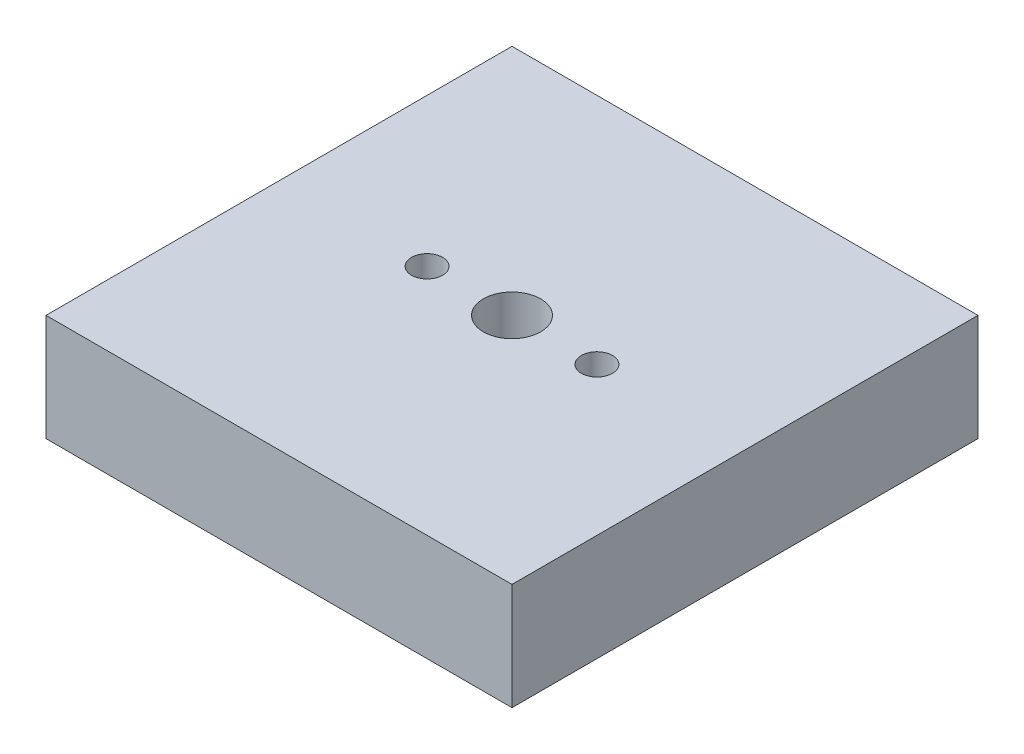
ISO-10303-21;
HEADER;
FILE_DESCRIPTION(('STEP AP214'),'2;1');
FILE_NAME('part.step','',(''),(''),'','','');
FILE_SCHEMA(('AUTOMOTIVE_DESIGN { 1 0 10303 214 1 1 1 1 }'));
ENDSEC;
DATA;
#1=APPLICATION_CONTEXT('core data for automotive mechanical design processes');
#2=APPLICATION_PROTOCOL_DEFINITION('international standard','automotive_design',2000,#1);
#3=PRODUCT_CONTEXT('',#1,'mechanical');
#4=PRODUCT('Part','Part','',(#3));
#5=PRODUCT_RELATED_PRODUCT_CATEGORY('part','',(#4));
#6=PRODUCT_DEFINITION_FORMATION('','',#4);
#7=PRODUCT_DEFINITION_CONTEXT('part definition',#1,'design');
#8=PRODUCT_DEFINITION('design','',#6,#7);
#9=PRODUCT_DEFINITION_SHAPE('','',#8);
#10=(LENGTH_UNIT() NAMED_UNIT(*) SI_UNIT(.MILLI.,.METRE.));
#11=(NAMED_UNIT(*) PLANE_ANGLE_UNIT() SI_UNIT($,.RADIAN.));
#12=(NAMED_UNIT(*) SI_UNIT($,.STERADIAN.) SOLID_ANGLE_UNIT());
#13=UNCERTAINTY_MEASURE_WITH_UNIT(LENGTH_MEASURE(1.E-05),#10,'distance_accuracy_value','');
#14=(GEOMETRIC_REPRESENTATION_CONTEXT(3) GLOBAL_UNCERTAINTY_ASSIGNED_CONTEXT((#13)) GLOBAL_UNIT_ASSIGNED_CONTEXT((#10,
#11,#12)) REPRESENTATION_CONTEXT('',''));
#15=CARTESIAN_POINT('',(0.,0.,0.));
#16=DIRECTION('',(0.,0.,1.));
#17=DIRECTION('',(1.,0.,0.));
#18=AXIS2_PLACEMENT_3D('',#15,#16,#17);
#19=CARTESIAN_POINT('',(0.,2.2,-9.6));
#20=DIRECTION('',(0.,-1.,0.));
#21=DIRECTION('',(0.,0.,-1.));
#22=AXIS2_PLACEMENT_3D('',#19,#20,#21);
#23=PLANE('',#22);
#24=CARTESIAN_POINT('',(3.05,2.2,-4.8));
#25=DIRECTION('',(0.,1.,0.));
#26=DIRECTION('',(0.,0.,1.));
#27=AXIS2_PLACEMENT_3D('',#24,#25,#26);
#28=CIRCLE('',#27,0.32);
#29=CARTESIAN_POINT('',(3.05,2.2,-4.48));
#30=VERTEX_POINT('',#29);
#31=EDGE_CURVE('E115',#30,#30,#28,.T.);
#32=ORIENTED_EDGE('',*,*,#31,.F.);
#33=EDGE_LOOP('',(#32));
#34=FACE_BOUND('',#33,.T.);
#35=DIRECTION('',(0.,0.,1.));
#36=VECTOR('',#35,1.);
#37=CARTESIAN_POINT('',(0.,2.2,0.));
#38=LINE('',#37,#36);
#39=CARTESIAN_POINT('',(0.,2.2,-9.6));
#40=VERTEX_POINT('',#39);
#41=CARTESIAN_POINT('',(0.,2.2,0.));
#42=VERTEX_POINT('',#41);
#43=EDGE_CURVE('E85',#40,#42,#38,.T.);
#44=ORIENTED_EDGE('',*,*,#43,.T.);
#45=DIRECTION('',(1.,0.,0.));
#46=VECTOR('',#45,1.);
#47=CARTESIAN_POINT('',(0.,2.2,0.));
#48=LINE('',#47,#46);
#49=CARTESIAN_POINT('',(9.6,2.2,0.));
#50=VERTEX_POINT('',#49);
#51=EDGE_CURVE('E80',#42,#50,#48,.T.);
#52=ORIENTED_EDGE('',*,*,#51,.T.);
#53=DIRECTION('',(0.,0.,-1.));
#54=VECTOR('',#53,1.);
#55=CARTESIAN_POINT('',(9.6,2.2,0.));
#56=LINE('',#55,#54);
#57=CARTESIAN_POINT('',(9.6,2.2,-9.6));
#58=VERTEX_POINT('',#57);
#59=EDGE_CURVE('E83',#50,#58,#56,.T.);
#60=ORIENTED_EDGE('',*,*,#59,.T.);
#61=DIRECTION('',(-1.,0.,0.));
#62=VECTOR('',#61,1.);
#63=CARTESIAN_POINT('',(0.,2.2,-9.6));
#64=LINE('',#63,#62);
#65=EDGE_CURVE('E50',#58,#40,#64,.T.);
#66=ORIENTED_EDGE('',*,*,#65,.T.);
#67=EDGE_LOOP('',(#44,#52,#60,#66));
#68=FACE_BOUND('',#67,.T.);
#69=CARTESIAN_POINT('',(4.8,2.2,-4.8));
#70=DIRECTION('',(0.,1.,0.));
#71=DIRECTION('',(0.,0.,1.));
#72=AXIS2_PLACEMENT_3D('',#69,#70,#71);
#73=CIRCLE('',#72,0.59);
#74=CARTESIAN_POINT('',(4.8,2.2,-4.21));
#75=VERTEX_POINT('',#74);
#76=EDGE_CURVE('E100',#75,#75,#73,.T.);
#77=ORIENTED_EDGE('',*,*,#76,.F.);
#78=EDGE_LOOP('',(#77));
#79=FACE_BOUND('',#78,.T.);
#80=CARTESIAN_POINT('',(6.55,2.2,-4.8));
#81=DIRECTION('',(0.,1.,0.));
#82=DIRECTION('',(0.,0.,1.));
#83=AXIS2_PLACEMENT_3D('',#80,#81,#82);
#84=CIRCLE('',#83,0.32);
#85=CARTESIAN_POINT('',(6.55,2.2,-4.48));
#86=VERTEX_POINT('',#85);
#87=EDGE_CURVE('E121',#86,#86,#84,.T.);
#88=ORIENTED_EDGE('',*,*,#87,.F.);
#89=EDGE_LOOP('',(#88));
#90=FACE_BOUND('',#89,.T.);
#91=ADVANCED_FACE('F33',(#34,#68,#79,#90),#23,.F.);
#92=CARTESIAN_POINT('',(0.,0.,-9.6));
#93=DIRECTION('',(0.,-1.,0.));
#94=DIRECTION('',(0.,0.,-1.));
#95=AXIS2_PLACEMENT_3D('',#92,#93,#94);
#96=PLANE('',#95);
#97=CARTESIAN_POINT('',(3.05,0.,-4.8));
#98=DIRECTION('',(0.,1.,0.));
#99=DIRECTION('',(0.,0.,1.));
#100=AXIS2_PLACEMENT_3D('',#97,#98,#99);
#101=CIRCLE('',#100,0.32);
#102=CARTESIAN_POINT('',(3.05,0.,-4.48));
#103=VERTEX_POINT('',#102);
#104=EDGE_CURVE('E118',#103,#103,#101,.T.);
#105=ORIENTED_EDGE('',*,*,#104,.T.);
#106=EDGE_LOOP('',(#105));
#107=FACE_BOUND('',#106,.T.);
#108=DIRECTION('',(0.,0.,1.));
#109=VECTOR('',#108,1.);
#110=CARTESIAN_POINT('',(0.,0.,0.));
#111=LINE('',#110,#109);
#112=CARTESIAN_POINT('',(0.,0.,-9.6));
#113=VERTEX_POINT('',#112);
#114=CARTESIAN_POINT('',(0.,0.,0.));
#115=VERTEX_POINT('',#114);
#116=EDGE_CURVE('E97',#113,#115,#111,.T.);
#117=ORIENTED_EDGE('',*,*,#116,.F.);
#118=DIRECTION('',(-1.,0.,0.));
#119=VECTOR('',#118,1.);
#120=CARTESIAN_POINT('',(0.,0.,-9.6));
#121=LINE('',#120,#119);
#122=CARTESIAN_POINT('',(9.6,0.,-9.6));
#123=VERTEX_POINT('',#122);
#124=EDGE_CURVE('E73',#123,#113,#121,.T.);
#125=ORIENTED_EDGE('',*,*,#124,.F.);
#126=DIRECTION('',(0.,0.,-1.));
#127=VECTOR('',#126,1.);
#128=CARTESIAN_POINT('',(9.6,0.,0.));
#129=LINE('',#128,#127);
#130=CARTESIAN_POINT('',(9.6,0.,0.));
#131=VERTEX_POINT('',#130);
#132=EDGE_CURVE('E67',#131,#123,#129,.T.);
#133=ORIENTED_EDGE('',*,*,#132,.F.);
#134=DIRECTION('',(1.,0.,0.));
#135=VECTOR('',#134,1.);
#136=CARTESIAN_POINT('',(0.,0.,0.));
#137=LINE('',#136,#135);
#138=EDGE_CURVE('E89',#115,#131,#137,.T.);
#139=ORIENTED_EDGE('',*,*,#138,.F.);
#140=EDGE_LOOP('',(#117,#125,#133,#139));
#141=FACE_BOUND('',#140,.T.);
#142=CARTESIAN_POINT('',(4.8,0.,-4.8));
#143=DIRECTION('',(0.,1.,0.));
#144=DIRECTION('',(0.,0.,1.));
#145=AXIS2_PLACEMENT_3D('',#142,#143,#144);
#146=CIRCLE('',#145,0.59);
#147=CARTESIAN_POINT('',(4.8,0.,-4.21));
#148=VERTEX_POINT('',#147);
#149=EDGE_CURVE('E112',#148,#148,#146,.T.);
#150=ORIENTED_EDGE('',*,*,#149,.T.);
#151=EDGE_LOOP('',(#150));
#152=FACE_BOUND('',#151,.T.);
#153=CARTESIAN_POINT('',(6.55,0.,-4.8));
#154=DIRECTION('',(0.,1.,0.));
#155=DIRECTION('',(0.,0.,1.));
#156=AXIS2_PLACEMENT_3D('',#153,#154,#155);
#157=CIRCLE('',#156,0.32);
#158=CARTESIAN_POINT('',(6.55,0.,-4.48));
#159=VERTEX_POINT('',#158);
#160=EDGE_CURVE('E124',#159,#159,#157,.T.);
#161=ORIENTED_EDGE('',*,*,#160,.T.);
#162=EDGE_LOOP('',(#161));
#163=FACE_BOUND('',#162,.T.);
#164=ADVANCED_FACE('F108',(#107,#141,#152,#163),#96,.T.);
#165=CARTESIAN_POINT('',(0.,2.2,0.));
#166=DIRECTION('',(1.,0.,0.));
#167=DIRECTION('',(0.,0.,-1.));
#168=AXIS2_PLACEMENT_3D('',#165,#166,#167);
#169=PLANE('',#168);
#170=ORIENTED_EDGE('',*,*,#116,.T.);
#171=DIRECTION('',(0.,-1.,0.));
#172=VECTOR('',#171,1.);
#173=CARTESIAN_POINT('',(0.,2.2,0.));
#174=LINE('',#173,#172);
#175=EDGE_CURVE('E11',#42,#115,#174,.T.);
#176=ORIENTED_EDGE('',*,*,#175,.F.);
#177=ORIENTED_EDGE('',*,*,#43,.F.);
#178=DIRECTION('',(0.,-1.,0.));
#179=VECTOR('',#178,1.);
#180=CARTESIAN_POINT('',(0.,2.2,-9.6));
#181=LINE('',#180,#179);
#182=EDGE_CURVE('E93',#40,#113,#181,.T.);
#183=ORIENTED_EDGE('',*,*,#182,.T.);
#184=EDGE_LOOP('',(#170,#176,#177,#183));
#185=FACE_BOUND('',#184,.T.);
#186=ADVANCED_FACE('F35',(#185),#169,.F.);
#187=CARTESIAN_POINT('',(0.,2.2,0.));
#188=DIRECTION('',(0.,0.,-1.));
#189=DIRECTION('',(-1.,0.,0.));
#190=AXIS2_PLACEMENT_3D('',#187,#188,#189);
#191=PLANE('',#190);
#192=ORIENTED_EDGE('',*,*,#138,.T.);
#193=DIRECTION('',(0.,-1.,0.));
#194=VECTOR('',#193,1.);
#195=CARTESIAN_POINT('',(9.6,2.2,0.));
#196=LINE('',#195,#194);
#197=EDGE_CURVE('E42',#50,#131,#196,.T.);
#198=ORIENTED_EDGE('',*,*,#197,.F.);
#199=ORIENTED_EDGE('',*,*,#51,.F.);
#200=ORIENTED_EDGE('',*,*,#175,.T.);
#201=EDGE_LOOP('',(#192,#198,#199,#200));
#202=FACE_BOUND('',#201,.T.);
#203=ADVANCED_FACE('F88',(#202),#191,.F.);
#204=CARTESIAN_POINT('',(9.6,2.2,0.));
#205=DIRECTION('',(-1.,0.,0.));
#206=DIRECTION('',(0.,0.,1.));
#207=AXIS2_PLACEMENT_3D('',#204,#205,#206);
#208=PLANE('',#207);
#209=ORIENTED_EDGE('',*,*,#132,.T.);
#210=DIRECTION('',(0.,-1.,0.));
#211=VECTOR('',#210,1.);
#212=CARTESIAN_POINT('',(9.6,2.2,-9.6));
#213=LINE('',#212,#211);
#214=EDGE_CURVE('E90',#58,#123,#213,.T.);
#215=ORIENTED_EDGE('',*,*,#214,.F.);
#216=ORIENTED_EDGE('',*,*,#59,.F.);
#217=ORIENTED_EDGE('',*,*,#197,.T.);
#218=EDGE_LOOP('',(#209,#215,#216,#217));
#219=FACE_BOUND('',#218,.T.);
#220=ADVANCED_FACE('F91',(#219),#208,.F.);
#221=CARTESIAN_POINT('',(0.,2.2,-9.6));
#222=DIRECTION('',(0.,0.,1.));
#223=DIRECTION('',(1.,0.,0.));
#224=AXIS2_PLACEMENT_3D('',#221,#222,#223);
#225=PLANE('',#224);
#226=ORIENTED_EDGE('',*,*,#124,.T.);
#227=ORIENTED_EDGE('',*,*,#182,.F.);
#228=ORIENTED_EDGE('',*,*,#65,.F.);
#229=ORIENTED_EDGE('',*,*,#214,.T.);
#230=EDGE_LOOP('',(#226,#227,#228,#229));
#231=FACE_BOUND('',#230,.T.);
#232=ADVANCED_FACE('F105',(#231),#225,.F.);
#233=CARTESIAN_POINT('',(4.8,2.2,-4.8));
#234=DIRECTION('',(0.,-1.,0.));
#235=DIRECTION('',(0.,0.,-1.));
#236=AXIS2_PLACEMENT_3D('',#233,#234,#235);
#237=CYLINDRICAL_SURFACE('',#236,0.59);
#238=ORIENTED_EDGE('',*,*,#76,.T.);
#239=EDGE_LOOP('',(#238));
#240=FACE_BOUND('',#239,.T.);
#241=ORIENTED_EDGE('',*,*,#149,.F.);
#242=EDGE_LOOP('',(#241));
#243=FACE_BOUND('',#242,.T.);
#244=ADVANCED_FACE('F143',(#240,#243),#237,.F.);
#245=CARTESIAN_POINT('',(3.05,2.2,-4.8));
#246=DIRECTION('',(0.,-1.,0.));
#247=DIRECTION('',(0.,0.,-1.));
#248=AXIS2_PLACEMENT_3D('',#245,#246,#247);
#249=CYLINDRICAL_SURFACE('',#248,0.32);
#250=ORIENTED_EDGE('',*,*,#31,.T.);
#251=EDGE_LOOP('',(#250));
#252=FACE_BOUND('',#251,.T.);
#253=ORIENTED_EDGE('',*,*,#104,.F.);
#254=EDGE_LOOP('',(#253));
#255=FACE_BOUND('',#254,.T.);
#256=ADVANCED_FACE('F189',(#252,#255),#249,.F.);
#257=CARTESIAN_POINT('',(6.55,2.2,-4.8));
#258=DIRECTION('',(0.,-1.,0.));
#259=DIRECTION('',(0.,0.,-1.));
#260=AXIS2_PLACEMENT_3D('',#257,#258,#259);
#261=CYLINDRICAL_SURFACE('',#260,0.32);
#262=ORIENTED_EDGE('',*,*,#87,.T.);
#263=EDGE_LOOP('',(#262));
#264=FACE_BOUND('',#263,.T.);
#265=ORIENTED_EDGE('',*,*,#160,.F.);
#266=EDGE_LOOP('',(#265));
#267=FACE_BOUND('',#266,.T.);
#268=ADVANCED_FACE('F130',(#264,#267),#261,.F.);
#269=CLOSED_SHELL('',(#91,#164,#186,#203,#220,#232,#244,#256,#268));
#270=MANIFOLD_SOLID_BREP('B2',#269);
#271=ADVANCED_BREP_SHAPE_REPRESENTATION('',(#18,#270),#14);
#272=SHAPE_DEFINITION_REPRESENTATION(#9,#271);
ENDSEC;
END-ISO-10303-21;
